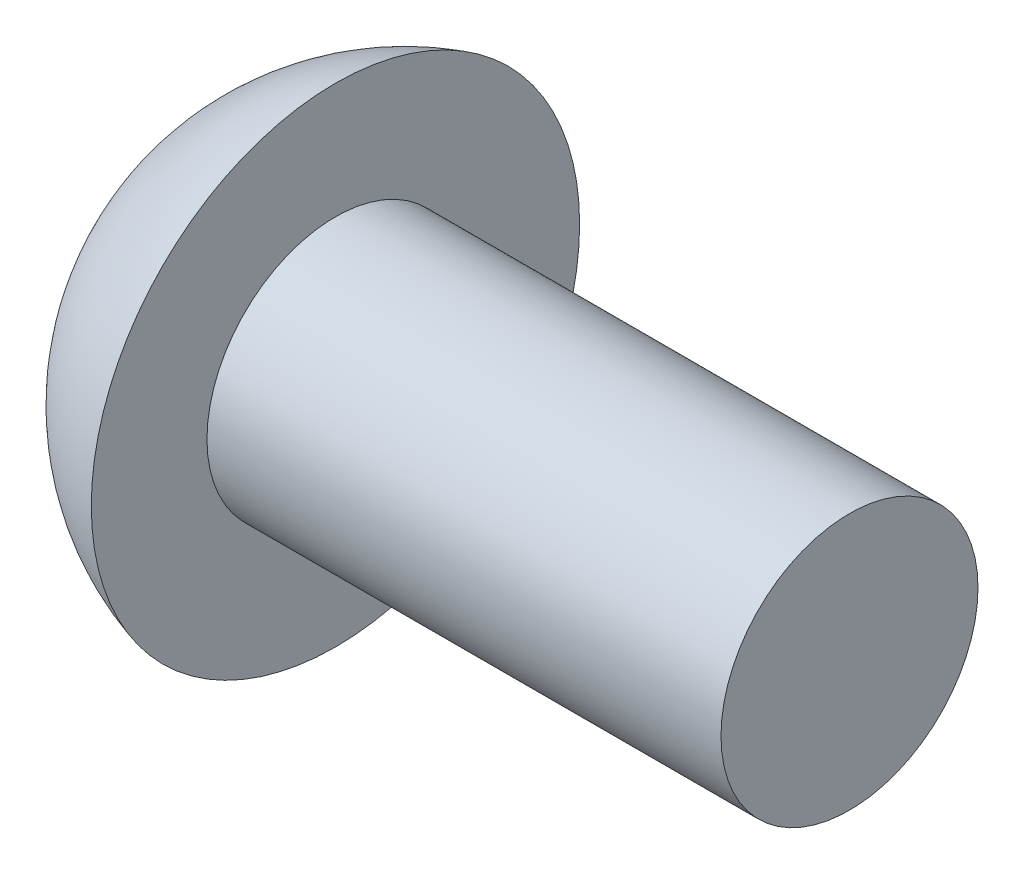
ISO-10303-21;
HEADER;
FILE_DESCRIPTION(('STEP AP214'),'2;1');
FILE_NAME('part.step','',(''),(''),'','','');
FILE_SCHEMA(('AUTOMOTIVE_DESIGN { 1 0 10303 214 1 1 1 1 }'));
ENDSEC;
DATA;
#1=APPLICATION_CONTEXT('core data for automotive mechanical design processes');
#2=APPLICATION_PROTOCOL_DEFINITION('international standard','automotive_design',2000,#1);
#3=PRODUCT_CONTEXT('',#1,'mechanical');
#4=PRODUCT('Part','Part','',(#3));
#5=PRODUCT_RELATED_PRODUCT_CATEGORY('part','',(#4));
#6=PRODUCT_DEFINITION_FORMATION('','',#4);
#7=PRODUCT_DEFINITION_CONTEXT('part definition',#1,'design');
#8=PRODUCT_DEFINITION('design','',#6,#7);
#9=PRODUCT_DEFINITION_SHAPE('','',#8);
#10=(LENGTH_UNIT() NAMED_UNIT(*) SI_UNIT(.MILLI.,.METRE.));
#11=(NAMED_UNIT(*) PLANE_ANGLE_UNIT() SI_UNIT($,.RADIAN.));
#12=(NAMED_UNIT(*) SI_UNIT($,.STERADIAN.) SOLID_ANGLE_UNIT());
#13=UNCERTAINTY_MEASURE_WITH_UNIT(LENGTH_MEASURE(1.E-05),#10,'distance_accuracy_value','');
#14=(GEOMETRIC_REPRESENTATION_CONTEXT(3) GLOBAL_UNCERTAINTY_ASSIGNED_CONTEXT((#13)) GLOBAL_UNIT_ASSIGNED_CONTEXT((#10,
#11,#12)) REPRESENTATION_CONTEXT('',''));
#15=CARTESIAN_POINT('',(0.,0.,0.));
#16=DIRECTION('',(0.,0.,1.));
#17=DIRECTION('',(1.,0.,0.));
#18=AXIS2_PLACEMENT_3D('',#15,#16,#17);
#19=CARTESIAN_POINT('',(0.,0.,0.));
#20=DIRECTION('',(1.,0.,0.));
#21=DIRECTION('',(0.,0.,-1.));
#22=AXIS2_PLACEMENT_3D('',#19,#20,#21);
#23=PLANE('',#22);
#24=CARTESIAN_POINT('',(0.,0.,0.));
#25=DIRECTION('',(-1.,0.,0.));
#26=DIRECTION('',(0.,0.,1.));
#27=AXIS2_PLACEMENT_3D('',#24,#25,#26);
#28=CIRCLE('',#27,1.65);
#29=CARTESIAN_POINT('',(0.,1.65,0.));
#30=VERTEX_POINT('',#29);
#31=EDGE_CURVE('E139',#30,#30,#28,.T.);
#32=ORIENTED_EDGE('',*,*,#31,.T.);
#33=EDGE_LOOP('',(#32));
#34=FACE_BOUND('',#33,.T.);
#35=DIRECTION('',(0.,0.866025403784439,-0.5));
#36=VECTOR('',#35,1.);
#37=CARTESIAN_POINT('',(0.,-0.999999999999999,-0.577350269189627));
#38=LINE('',#37,#36);
#39=CARTESIAN_POINT('',(0.,-0.999999999999999,-0.577350269189627));
#40=VERTEX_POINT('',#39);
#41=CARTESIAN_POINT('',(0.,0.,-1.15470053837925));
#42=VERTEX_POINT('',#41);
#43=EDGE_CURVE('E65',#40,#42,#38,.T.);
#44=ORIENTED_EDGE('',*,*,#43,.T.);
#45=DIRECTION('',(0.,0.866025403784438,0.5));
#46=VECTOR('',#45,1.);
#47=CARTESIAN_POINT('',(0.,0.,-1.15470053837925));
#48=LINE('',#47,#46);
#49=CARTESIAN_POINT('',(0.,1.,-0.577350269189625));
#50=VERTEX_POINT('',#49);
#51=EDGE_CURVE('E124',#42,#50,#48,.T.);
#52=ORIENTED_EDGE('',*,*,#51,.T.);
#53=DIRECTION('',(0.,0.,1.));
#54=VECTOR('',#53,1.);
#55=CARTESIAN_POINT('',(0.,1.,-0.577350269189625));
#56=LINE('',#55,#54);
#57=CARTESIAN_POINT('',(0.,1.,0.577350269189626));
#58=VERTEX_POINT('',#57);
#59=EDGE_CURVE('E122',#50,#58,#56,.T.);
#60=ORIENTED_EDGE('',*,*,#59,.T.);
#61=DIRECTION('',(0.,-0.866025403784439,0.5));
#62=VECTOR('',#61,1.);
#63=CARTESIAN_POINT('',(0.,1.,0.577350269189626));
#64=LINE('',#63,#62);
#65=CARTESIAN_POINT('',(0.,0.,1.15470053837925));
#66=VERTEX_POINT('',#65);
#67=EDGE_CURVE('E101',#58,#66,#64,.T.);
#68=ORIENTED_EDGE('',*,*,#67,.T.);
#69=DIRECTION('',(0.,-0.866025403784438,-0.5));
#70=VECTOR('',#69,1.);
#71=CARTESIAN_POINT('',(0.,0.,1.15470053837925));
#72=LINE('',#71,#70);
#73=CARTESIAN_POINT('',(0.,-1.,0.577350269189626));
#74=VERTEX_POINT('',#73);
#75=EDGE_CURVE('E112',#66,#74,#72,.T.);
#76=ORIENTED_EDGE('',*,*,#75,.T.);
#77=DIRECTION('',(0.,0.,-1.));
#78=VECTOR('',#77,1.);
#79=CARTESIAN_POINT('',(0.,-1.,0.577350269189626));
#80=LINE('',#79,#78);
#81=EDGE_CURVE('E118',#74,#40,#80,.T.);
#82=ORIENTED_EDGE('',*,*,#81,.T.);
#83=EDGE_LOOP('',(#44,#52,#60,#68,#76,#82));
#84=FACE_BOUND('',#83,.T.);
#85=ADVANCED_FACE('F51',(#34,#84),#23,.F.);
#86=CARTESIAN_POINT('',(1.65,0.,0.));
#87=DIRECTION('',(1.,0.,0.));
#88=DIRECTION('',(0.,0.,-1.));
#89=AXIS2_PLACEMENT_3D('',#86,#87,#88);
#90=PLANE('',#89);
#91=CARTESIAN_POINT('',(1.65,0.,0.));
#92=DIRECTION('',(-1.,0.,0.));
#93=DIRECTION('',(0.,0.,1.));
#94=AXIS2_PLACEMENT_3D('',#91,#92,#93);
#95=CIRCLE('',#94,2.85);
#96=CARTESIAN_POINT('',(1.65,2.85,0.));
#97=VERTEX_POINT('',#96);
#98=EDGE_CURVE('E142',#97,#97,#95,.T.);
#99=ORIENTED_EDGE('',*,*,#98,.F.);
#100=EDGE_LOOP('',(#99));
#101=FACE_BOUND('',#100,.T.);
#102=CARTESIAN_POINT('',(1.65,0.,0.));
#103=DIRECTION('',(1.,0.,0.));
#104=DIRECTION('',(0.,0.,-1.));
#105=AXIS2_PLACEMENT_3D('',#102,#103,#104);
#106=CIRCLE('',#105,1.5);
#107=CARTESIAN_POINT('',(1.65,0.,-1.5));
#108=VERTEX_POINT('',#107);
#109=EDGE_CURVE('E54',#108,#108,#106,.T.);
#110=ORIENTED_EDGE('',*,*,#109,.F.);
#111=EDGE_LOOP('',(#110));
#112=FACE_BOUND('',#111,.T.);
#113=ADVANCED_FACE('F154',(#101,#112),#90,.T.);
#114=CARTESIAN_POINT('',(7.65,0.,0.));
#115=DIRECTION('',(-1.,0.,0.));
#116=DIRECTION('',(0.,0.,1.));
#117=AXIS2_PLACEMENT_3D('',#114,#115,#116);
#118=CYLINDRICAL_SURFACE('',#117,1.5);
#119=CARTESIAN_POINT('',(7.65,0.,0.));
#120=DIRECTION('',(1.,0.,0.));
#121=DIRECTION('',(0.,0.,-1.));
#122=AXIS2_PLACEMENT_3D('',#119,#120,#121);
#123=CIRCLE('',#122,1.5);
#124=CARTESIAN_POINT('',(7.65,0.,-1.5));
#125=VERTEX_POINT('',#124);
#126=EDGE_CURVE('E13',#125,#125,#123,.T.);
#127=ORIENTED_EDGE('',*,*,#126,.F.);
#128=EDGE_LOOP('',(#127));
#129=FACE_BOUND('',#128,.T.);
#130=ORIENTED_EDGE('',*,*,#109,.T.);
#131=EDGE_LOOP('',(#130));
#132=FACE_BOUND('',#131,.T.);
#133=ADVANCED_FACE('F152',(#129,#132),#118,.T.);
#134=CARTESIAN_POINT('',(7.65,0.,0.));
#135=DIRECTION('',(1.,0.,0.));
#136=DIRECTION('',(0.,0.,-1.));
#137=AXIS2_PLACEMENT_3D('',#134,#135,#136);
#138=PLANE('',#137);
#139=ORIENTED_EDGE('',*,*,#126,.T.);
#140=EDGE_LOOP('',(#139));
#141=FACE_BOUND('',#140,.T.);
#142=ADVANCED_FACE('F160',(#141),#138,.T.);
#143=CARTESIAN_POINT('',(2.46136363636364,0.,0.));
#144=DIRECTION('',(-1.,0.,0.));
#145=DIRECTION('',(0.,1.,0.));
#146=AXIS2_PLACEMENT_3D('',#143,#144,#145);
#147=SPHERICAL_SURFACE('',#146,2.96324331610032);
#148=CARTESIAN_POINT('',(1.65,2.85,0.));
#149=CARTESIAN_POINT('',(1.6291329532092,2.84405942433189,0.));
#150=CARTESIAN_POINT('',(1.60833117382293,2.83788959578563,0.));
#151=CARTESIAN_POINT('',(1.56686813231484,2.82509458286439,0.));
#152=CARTESIAN_POINT('',(1.54620687019302,2.81846939848941,0.));
#153=CARTESIAN_POINT('',(1.50503484566925,2.80476682383831,0.));
#154=CARTESIAN_POINT('',(1.48452408326729,2.79768943356219,0.));
#155=CARTESIAN_POINT('',(1.44366294986413,2.78308587407077,0.));
#156=CARTESIAN_POINT('',(1.42331257886293,2.77555970485548,0.));
#157=CARTESIAN_POINT('',(1.38278204742793,2.7600622151904,0.));
#158=CARTESIAN_POINT('',(1.36260188699412,2.75209089474062,0.));
#159=CARTESIAN_POINT('',(1.32242151243736,2.73570694930301,0.));
#160=CARTESIAN_POINT('',(1.30242129831441,2.72729432431518,0.));
#161=CARTESIAN_POINT('',(1.26261046565632,2.71003182827508,0.));
#162=CARTESIAN_POINT('',(1.24279984712117,2.70118195722281,0.));
#163=CARTESIAN_POINT('',(1.20337776335067,2.68304923878237,0.));
#164=CARTESIAN_POINT('',(1.1837662981153,2.67376639139422,0.));
#165=CARTESIAN_POINT('',(1.1447519825989,2.65477219882087,0.));
#166=CARTESIAN_POINT('',(1.12534913231787,2.64506085363569,0.));
#167=CARTESIAN_POINT('',(1.08676140771064,2.62521435075984,0.));
#168=CARTESIAN_POINT('',(1.06757653338444,2.61507919306917,0.));
#169=CARTESIAN_POINT('',(1.02943401652561,2.59438995493852,0.));
#170=CARTESIAN_POINT('',(1.01047637399298,2.58383587449854,0.));
#171=CARTESIAN_POINT('',(0.972797466930397,2.56231388273834,0.));
#172=CARTESIAN_POINT('',(0.95407620240045,2.55134597141814,0.));
#173=CARTESIAN_POINT('',(0.916879083510753,2.52900160942095,0.));
#174=CARTESIAN_POINT('',(0.898403229151003,2.51762515874398,0.));
#175=CARTESIAN_POINT('',(0.861705844369813,2.49446920665867,0.));
#176=CARTESIAN_POINT('',(0.843484313948373,2.48268970525034,0.));
#177=CARTESIAN_POINT('',(0.807304368112072,2.45873333478155,0.));
#178=CARTESIAN_POINT('',(0.789345952697212,2.44655646572109,0.));
#179=CARTESIAN_POINT('',(0.75370090100119,2.42181123473927,0.));
#180=CARTESIAN_POINT('',(0.736014264720029,2.40924287281792,0.));
#181=CARTESIAN_POINT('',(0.700921304297327,2.38372071978322,0.));
#182=CARTESIAN_POINT('',(0.683514980155786,2.37076692866989,0.));
#183=CARTESIAN_POINT('',(0.648991041780254,2.34448016687239,0.));
#184=CARTESIAN_POINT('',(0.631873427546264,2.33114719618824,0.));
#185=CARTESIAN_POINT('',(0.597935167464229,2.30410850780733,0.));
#186=CARTESIAN_POINT('',(0.581114521616186,2.29040279011058,0.));
#187=CARTESIAN_POINT('',(0.547778313510556,2.26262522009638,0.));
#188=CARTESIAN_POINT('',(0.53126275125297,2.24855336777893,0.));
#189=CARTESIAN_POINT('',(0.498544678343689,2.22005031755867,0.));
#190=CARTESIAN_POINT('',(0.482342167691996,2.20561911965587,0.));
#191=CARTESIAN_POINT('',(0.450258014976531,2.17640434066839,0.));
#192=CARTESIAN_POINT('',(0.43437637291276,2.16162075958372,0.));
#193=CARTESIAN_POINT('',(0.402941619550878,2.13170834664476,0.));
#194=CARTESIAN_POINT('',(0.387388508252768,2.11657951479048,0.));
#195=CARTESIAN_POINT('',(0.356618320097299,2.08598389929346,0.));
#196=CARTESIAN_POINT('',(0.34140124323994,2.07051711565072,0.));
#197=CARTESIAN_POINT('',(0.311310465524572,2.03925305860096,0.));
#198=CARTESIAN_POINT('',(0.296436764666563,2.02345578519394,0.));
#199=CARTESIAN_POINT('',(0.267039914826372,1.99153837009932,0.));
#200=CARTESIAN_POINT('',(0.25251676584419,1.97541822841172,0.));
#201=CARTESIAN_POINT('',(0.223828026576252,1.94286285396016,0.));
#202=CARTESIAN_POINT('',(0.209662436290495,1.9264276211962,0.));
#203=CARTESIAN_POINT('',(0.181695648470199,1.89324999399595,0.));
#204=CARTESIAN_POINT('',(0.167894450935661,1.87650759955966,0.));
#205=CARTESIAN_POINT('',(0.140663107839179,1.84272372592911,0.));
#206=CARTESIAN_POINT('',(0.127232962277235,1.82568224673485,0.));
#207=CARTESIAN_POINT('',(0.100750199712538,1.79130842734056,0.));
#208=CARTESIAN_POINT('',(0.0876975827097848,1.77397608714052,0.));
#209=CARTESIAN_POINT('',(0.0619761852154649,1.73902890032392,0.));
#210=CARTESIAN_POINT('',(0.0493074047238985,1.72141405370734,0.));
#211=CARTESIAN_POINT('',(0.0243597526152558,1.68591038036187,0.));
#212=CARTESIAN_POINT('',(0.0120808809981796,1.66802155363296,0.));
#213=CARTESIAN_POINT('',(0.,1.65,0.));
#214=B_SPLINE_CURVE_WITH_KNOTS('',3,(#148,#149,#150,#151,#152,#153,#154,#155,#156,#157,#158,
#159,#160,#161,#162,#163,#164,#165,#166,#167,#168,#169,#170,#171,#172,#173,#174,#175,#176,#177,
#178,#179,#180,#181,#182,#183,#184,#185,#186,#187,#188,#189,#190,#191,#192,#193,#194,#195,#196,
#197,#198,#199,#200,#201,#202,#203,#204,#205,#206,#207,#208,#209,#210,#211,#212,#213),
.UNSPECIFIED.,.F.,.F.,(4,2,2,2,2,2,2,2,2,2,2,2,2,2,2,2,2,2,2,2,2,2,2,2,2,2,2,2,2,2,2,2,4),(0.,
0.0650872188273316,0.130174437654663,0.195261656481995,0.260348875309327,0.325436094136658,
0.39052331296399,0.455610531791322,0.520697750618653,0.585784969445985,0.650872188273316,
0.715959407100648,0.78104662592798,0.846133844755311,0.911221063582643,0.976308282409975,
1.04139550123731,1.10648272006464,1.17156993889197,1.2366571577193,1.30174437654663,
1.36683159537396,1.4319188142013,1.49700603302863,1.56209325185596,1.62718047068329,
1.69226768951062,1.75735490833795,1.82244212716529,1.88752934599262,1.95261656481995,
2.01770378364728,2.08279100247461),.UNSPECIFIED.);
#215=EDGE_CURVE('BSEAM167',#97,#30,#214,.T.);
#216=ORIENTED_EDGE('',*,*,#98,.T.);
#217=ORIENTED_EDGE('',*,*,#31,.F.);
#218=ORIENTED_EDGE('',*,*,#215,.T.);
#219=ORIENTED_EDGE('',*,*,#215,.F.);
#220=EDGE_LOOP('',(#216,#218,#217,#219));
#221=FACE_BOUND('',#220,.T.);
#222=ADVANCED_FACE('F167',(#221),#147,.T.);
#223=CARTESIAN_POINT('',(1.04,-0.999999999999999,-0.577350269189627));
#224=DIRECTION('',(0.,0.5,0.866025403784439));
#225=DIRECTION('',(0.,-0.866025403784439,0.5));
#226=AXIS2_PLACEMENT_3D('',#223,#224,#225);
#227=PLANE('',#226);
#228=ORIENTED_EDGE('',*,*,#43,.F.);
#229=DIRECTION('',(-1.,0.,0.));
#230=VECTOR('',#229,1.);
#231=CARTESIAN_POINT('',(1.04,-0.999999999999999,-0.577350269189627));
#232=LINE('',#231,#230);
#233=CARTESIAN_POINT('',(1.04,-0.999999999999999,-0.577350269189627));
#234=VERTEX_POINT('',#233);
#235=EDGE_CURVE('E130',#234,#40,#232,.T.);
#236=ORIENTED_EDGE('',*,*,#235,.F.);
#237=DIRECTION('',(0.,0.866025403784439,-0.5));
#238=VECTOR('',#237,1.);
#239=CARTESIAN_POINT('',(1.04,-0.999999999999999,-0.577350269189627));
#240=LINE('',#239,#238);
#241=CARTESIAN_POINT('',(1.04,0.,-1.15470053837925));
#242=VERTEX_POINT('',#241);
#243=EDGE_CURVE('E129',#234,#242,#240,.T.);
#244=ORIENTED_EDGE('',*,*,#243,.T.);
#245=DIRECTION('',(-1.,0.,0.));
#246=VECTOR('',#245,1.);
#247=CARTESIAN_POINT('',(1.04,0.,-1.15470053837925));
#248=LINE('',#247,#246);
#249=EDGE_CURVE('E137',#242,#42,#248,.T.);
#250=ORIENTED_EDGE('',*,*,#249,.T.);
#251=EDGE_LOOP('',(#228,#236,#244,#250));
#252=FACE_BOUND('',#251,.T.);
#253=ADVANCED_FACE('F171',(#252),#227,.T.);
#254=CARTESIAN_POINT('',(1.04,0.,-1.15470053837925));
#255=DIRECTION('',(0.,-0.5,0.866025403784439));
#256=DIRECTION('',(0.,-0.866025403784438,-0.5));
#257=AXIS2_PLACEMENT_3D('',#254,#255,#256);
#258=PLANE('',#257);
#259=ORIENTED_EDGE('',*,*,#51,.F.);
#260=ORIENTED_EDGE('',*,*,#249,.F.);
#261=DIRECTION('',(0.,0.866025403784438,0.5));
#262=VECTOR('',#261,1.);
#263=CARTESIAN_POINT('',(1.04,0.,-1.15470053837925));
#264=LINE('',#263,#262);
#265=CARTESIAN_POINT('',(1.04,1.,-0.577350269189625));
#266=VERTEX_POINT('',#265);
#267=EDGE_CURVE('E242',#242,#266,#264,.T.);
#268=ORIENTED_EDGE('',*,*,#267,.T.);
#269=DIRECTION('',(-1.,0.,0.));
#270=VECTOR('',#269,1.);
#271=CARTESIAN_POINT('',(1.04,1.,-0.577350269189625));
#272=LINE('',#271,#270);
#273=EDGE_CURVE('E135',#266,#50,#272,.T.);
#274=ORIENTED_EDGE('',*,*,#273,.T.);
#275=EDGE_LOOP('',(#259,#260,#268,#274));
#276=FACE_BOUND('',#275,.T.);
#277=ADVANCED_FACE('F174',(#276),#258,.T.);
#278=CARTESIAN_POINT('',(1.04,1.,-0.577350269189625));
#279=DIRECTION('',(0.,-1.,0.));
#280=DIRECTION('',(0.,0.,-1.));
#281=AXIS2_PLACEMENT_3D('',#278,#279,#280);
#282=PLANE('',#281);
#283=ORIENTED_EDGE('',*,*,#59,.F.);
#284=ORIENTED_EDGE('',*,*,#273,.F.);
#285=DIRECTION('',(0.,0.,1.));
#286=VECTOR('',#285,1.);
#287=CARTESIAN_POINT('',(1.04,1.,-0.577350269189625));
#288=LINE('',#287,#286);
#289=CARTESIAN_POINT('',(1.04,1.,0.577350269189626));
#290=VERTEX_POINT('',#289);
#291=EDGE_CURVE('E74',#266,#290,#288,.T.);
#292=ORIENTED_EDGE('',*,*,#291,.T.);
#293=DIRECTION('',(-1.,0.,0.));
#294=VECTOR('',#293,1.);
#295=CARTESIAN_POINT('',(1.04,1.,0.577350269189626));
#296=LINE('',#295,#294);
#297=EDGE_CURVE('E108',#290,#58,#296,.T.);
#298=ORIENTED_EDGE('',*,*,#297,.T.);
#299=EDGE_LOOP('',(#283,#284,#292,#298));
#300=FACE_BOUND('',#299,.T.);
#301=ADVANCED_FACE('F177',(#300),#282,.T.);
#302=CARTESIAN_POINT('',(1.04,1.,0.577350269189626));
#303=DIRECTION('',(0.,-0.5,-0.866025403784439));
#304=DIRECTION('',(0.,0.866025403784439,-0.5));
#305=AXIS2_PLACEMENT_3D('',#302,#303,#304);
#306=PLANE('',#305);
#307=ORIENTED_EDGE('',*,*,#67,.F.);
#308=ORIENTED_EDGE('',*,*,#297,.F.);
#309=DIRECTION('',(0.,-0.866025403784439,0.5));
#310=VECTOR('',#309,1.);
#311=CARTESIAN_POINT('',(1.04,1.,0.577350269189626));
#312=LINE('',#311,#310);
#313=CARTESIAN_POINT('',(1.04,0.,1.15470053837925));
#314=VERTEX_POINT('',#313);
#315=EDGE_CURVE('E105',#290,#314,#312,.T.);
#316=ORIENTED_EDGE('',*,*,#315,.T.);
#317=DIRECTION('',(-1.,0.,0.));
#318=VECTOR('',#317,1.);
#319=CARTESIAN_POINT('',(1.04,0.,1.15470053837925));
#320=LINE('',#319,#318);
#321=EDGE_CURVE('E96',#314,#66,#320,.T.);
#322=ORIENTED_EDGE('',*,*,#321,.T.);
#323=EDGE_LOOP('',(#307,#308,#316,#322));
#324=FACE_BOUND('',#323,.T.);
#325=ADVANCED_FACE('F98',(#324),#306,.T.);
#326=CARTESIAN_POINT('',(1.04,0.,1.15470053837925));
#327=DIRECTION('',(0.,0.5,-0.866025403784439));
#328=DIRECTION('',(0.,0.866025403784438,0.5));
#329=AXIS2_PLACEMENT_3D('',#326,#327,#328);
#330=PLANE('',#329);
#331=ORIENTED_EDGE('',*,*,#75,.F.);
#332=ORIENTED_EDGE('',*,*,#321,.F.);
#333=DIRECTION('',(0.,-0.866025403784438,-0.5));
#334=VECTOR('',#333,1.);
#335=CARTESIAN_POINT('',(1.04,0.,1.15470053837925));
#336=LINE('',#335,#334);
#337=CARTESIAN_POINT('',(1.04,-1.,0.577350269189626));
#338=VERTEX_POINT('',#337);
#339=EDGE_CURVE('E217',#314,#338,#336,.T.);
#340=ORIENTED_EDGE('',*,*,#339,.T.);
#341=DIRECTION('',(-1.,0.,0.));
#342=VECTOR('',#341,1.);
#343=CARTESIAN_POINT('',(1.04,-1.,0.577350269189626));
#344=LINE('',#343,#342);
#345=EDGE_CURVE('E109',#338,#74,#344,.T.);
#346=ORIENTED_EDGE('',*,*,#345,.T.);
#347=EDGE_LOOP('',(#331,#332,#340,#346));
#348=FACE_BOUND('',#347,.T.);
#349=ADVANCED_FACE('F113',(#348),#330,.T.);
#350=CARTESIAN_POINT('',(1.04,-1.,0.577350269189626));
#351=DIRECTION('',(0.,1.,0.));
#352=DIRECTION('',(0.,0.,1.));
#353=AXIS2_PLACEMENT_3D('',#350,#351,#352);
#354=PLANE('',#353);
#355=ORIENTED_EDGE('',*,*,#81,.F.);
#356=ORIENTED_EDGE('',*,*,#345,.F.);
#357=DIRECTION('',(0.,0.,-1.));
#358=VECTOR('',#357,1.);
#359=CARTESIAN_POINT('',(1.04,-1.,0.577350269189626));
#360=LINE('',#359,#358);
#361=EDGE_CURVE('E132',#338,#234,#360,.T.);
#362=ORIENTED_EDGE('',*,*,#361,.T.);
#363=ORIENTED_EDGE('',*,*,#235,.T.);
#364=EDGE_LOOP('',(#355,#356,#362,#363));
#365=FACE_BOUND('',#364,.T.);
#366=ADVANCED_FACE('F186',(#365),#354,.T.);
#367=CARTESIAN_POINT('',(1.04,0.,1.15470053837925));
#368=DIRECTION('',(0.86602540378444,-0.249999999999999,0.433012701892218));
#369=DIRECTION('',(0.447213595499956,0.,-0.894427190999917));
#370=AXIS2_PLACEMENT_3D('',#367,#368,#369);
#371=PLANE('',#370);
#372=ORIENTED_EDGE('',*,*,#339,.F.);
#373=DIRECTION('',(-0.447213595499956,0.,0.894427190999917));
#374=VECTOR('',#373,1.);
#375=CARTESIAN_POINT('',(1.04,0.,1.15470053837925));
#376=LINE('',#375,#374);
#377=CARTESIAN_POINT('',(1.61735026918962,0.,0.));
#378=VERTEX_POINT('',#377);
#379=EDGE_CURVE('E219',#378,#314,#376,.T.);
#380=ORIENTED_EDGE('',*,*,#379,.F.);
#381=DIRECTION('',(-0.447213595499956,-0.774596669241484,0.447213595499958));
#382=VECTOR('',#381,1.);
#383=CARTESIAN_POINT('',(1.04,-1.,0.577350269189626));
#384=LINE('',#383,#382);
#385=EDGE_CURVE('E222',#378,#338,#384,.T.);
#386=ORIENTED_EDGE('',*,*,#385,.T.);
#387=EDGE_LOOP('',(#372,#380,#386));
#388=FACE_BOUND('',#387,.T.);
#389=ADVANCED_FACE('F189',(#388),#371,.F.);
#390=CARTESIAN_POINT('',(1.04,-1.,0.577350269189626));
#391=DIRECTION('',(0.86602540378444,-0.499999999999998,0.));
#392=DIRECTION('',(0.499999999999998,0.86602540378444,0.));
#393=AXIS2_PLACEMENT_3D('',#390,#391,#392);
#394=PLANE('',#393);
#395=ORIENTED_EDGE('',*,*,#361,.F.);
#396=ORIENTED_EDGE('',*,*,#385,.F.);
#397=DIRECTION('',(-0.447213595499956,-0.774596669241484,-0.447213595499958));
#398=VECTOR('',#397,1.);
#399=CARTESIAN_POINT('',(1.04,-0.999999999999999,-0.577350269189627));
#400=LINE('',#399,#398);
#401=EDGE_CURVE('E246',#378,#234,#400,.T.);
#402=ORIENTED_EDGE('',*,*,#401,.T.);
#403=EDGE_LOOP('',(#395,#396,#402));
#404=FACE_BOUND('',#403,.T.);
#405=ADVANCED_FACE('F191',(#404),#394,.F.);
#406=CARTESIAN_POINT('',(1.04,-0.999999999999999,-0.577350269189627));
#407=DIRECTION('',(0.86602540378444,-0.249999999999999,-0.433012701892218));
#408=DIRECTION('',(-0.447213595499956,0.,-0.894427190999917));
#409=AXIS2_PLACEMENT_3D('',#406,#407,#408);
#410=PLANE('',#409);
#411=ORIENTED_EDGE('',*,*,#243,.F.);
#412=ORIENTED_EDGE('',*,*,#401,.F.);
#413=DIRECTION('',(-0.447213595499956,0.,-0.894427190999917));
#414=VECTOR('',#413,1.);
#415=CARTESIAN_POINT('',(1.04,0.,-1.15470053837925));
#416=LINE('',#415,#414);
#417=EDGE_CURVE('E254',#378,#242,#416,.T.);
#418=ORIENTED_EDGE('',*,*,#417,.T.);
#419=EDGE_LOOP('',(#411,#412,#418));
#420=FACE_BOUND('',#419,.T.);
#421=ADVANCED_FACE('F194',(#420),#410,.F.);
#422=CARTESIAN_POINT('',(1.04,0.,-1.15470053837925));
#423=DIRECTION('',(0.86602540378444,0.249999999999999,-0.433012701892217));
#424=DIRECTION('',(-0.447213595499956,0.,-0.894427190999917));
#425=AXIS2_PLACEMENT_3D('',#422,#423,#424);
#426=PLANE('',#425);
#427=ORIENTED_EDGE('',*,*,#267,.F.);
#428=ORIENTED_EDGE('',*,*,#417,.F.);
#429=DIRECTION('',(-0.447213595499956,0.774596669241484,-0.447213595499958));
#430=VECTOR('',#429,1.);
#431=CARTESIAN_POINT('',(1.04,1.,-0.577350269189625));
#432=LINE('',#431,#430);
#433=EDGE_CURVE('E256',#378,#266,#432,.T.);
#434=ORIENTED_EDGE('',*,*,#433,.T.);
#435=EDGE_LOOP('',(#427,#428,#434));
#436=FACE_BOUND('',#435,.T.);
#437=ADVANCED_FACE('F198',(#436),#426,.F.);
#438=CARTESIAN_POINT('',(1.04,1.,-0.577350269189625));
#439=DIRECTION('',(0.86602540378444,0.499999999999998,0.));
#440=DIRECTION('',(-0.499999999999998,0.86602540378444,0.));
#441=AXIS2_PLACEMENT_3D('',#438,#439,#440);
#442=PLANE('',#441);
#443=ORIENTED_EDGE('',*,*,#291,.F.);
#444=ORIENTED_EDGE('',*,*,#433,.F.);
#445=DIRECTION('',(-0.447213595499956,0.774596669241484,0.447213595499958));
#446=VECTOR('',#445,1.);
#447=CARTESIAN_POINT('',(1.04,1.,0.577350269189626));
#448=LINE('',#447,#446);
#449=EDGE_CURVE('E250',#378,#290,#448,.T.);
#450=ORIENTED_EDGE('',*,*,#449,.T.);
#451=EDGE_LOOP('',(#443,#444,#450));
#452=FACE_BOUND('',#451,.T.);
#453=ADVANCED_FACE('F202',(#452),#442,.F.);
#454=CARTESIAN_POINT('',(1.04,1.,0.577350269189626));
#455=DIRECTION('',(0.86602540378444,0.249999999999999,0.433012701892218));
#456=DIRECTION('',(0.447213595499956,0.,-0.894427190999917));
#457=AXIS2_PLACEMENT_3D('',#454,#455,#456);
#458=PLANE('',#457);
#459=ORIENTED_EDGE('',*,*,#315,.F.);
#460=ORIENTED_EDGE('',*,*,#449,.F.);
#461=ORIENTED_EDGE('',*,*,#379,.T.);
#462=EDGE_LOOP('',(#459,#460,#461));
#463=FACE_BOUND('',#462,.T.);
#464=ADVANCED_FACE('F206',(#463),#458,.F.);
#465=CLOSED_SHELL('',(#85,#113,#133,#142,#222,#253,#277,#301,#325,#349,#366,#389,#405,#421,#437,
#453,#464));
#466=MANIFOLD_SOLID_BREP('B2',#465);
#467=ADVANCED_BREP_SHAPE_REPRESENTATION('',(#18,#466),#14);
#468=SHAPE_DEFINITION_REPRESENTATION(#9,#467);
ENDSEC;
END-ISO-10303-21;
